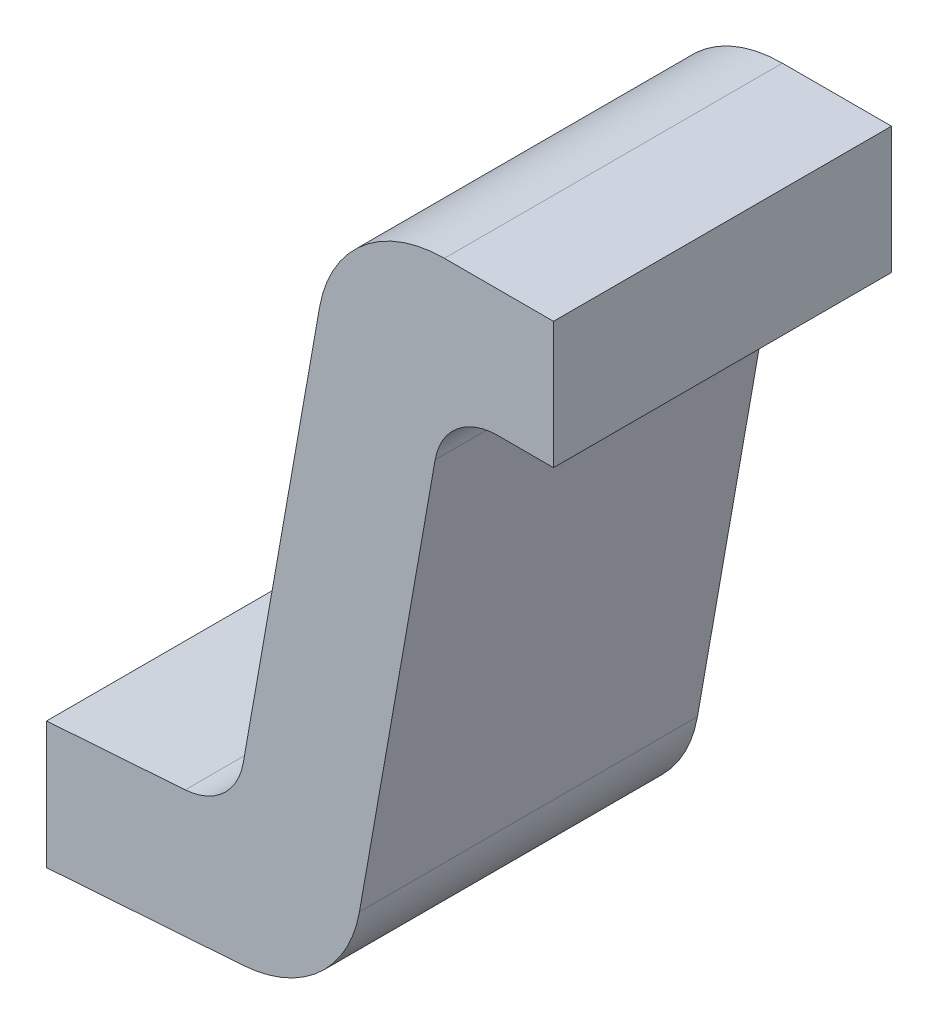
ISO-10303-21;
HEADER;
FILE_DESCRIPTION(('STEP AP214'),'2;1');
FILE_NAME('part.step','',(''),(''),'','','');
FILE_SCHEMA(('AUTOMOTIVE_DESIGN { 1 0 10303 214 1 1 1 1 }'));
ENDSEC;
DATA;
#1=APPLICATION_CONTEXT('core data for automotive mechanical design processes');
#2=APPLICATION_PROTOCOL_DEFINITION('international standard','automotive_design',2000,#1);
#3=PRODUCT_CONTEXT('',#1,'mechanical');
#4=PRODUCT('Part','Part','',(#3));
#5=PRODUCT_RELATED_PRODUCT_CATEGORY('part','',(#4));
#6=PRODUCT_DEFINITION_FORMATION('','',#4);
#7=PRODUCT_DEFINITION_CONTEXT('part definition',#1,'design');
#8=PRODUCT_DEFINITION('design','',#6,#7);
#9=PRODUCT_DEFINITION_SHAPE('','',#8);
#10=(LENGTH_UNIT() NAMED_UNIT(*) SI_UNIT(.MILLI.,.METRE.));
#11=(NAMED_UNIT(*) PLANE_ANGLE_UNIT() SI_UNIT($,.RADIAN.));
#12=(NAMED_UNIT(*) SI_UNIT($,.STERADIAN.) SOLID_ANGLE_UNIT());
#13=UNCERTAINTY_MEASURE_WITH_UNIT(LENGTH_MEASURE(1.E-05),#10,'distance_accuracy_value','');
#14=(GEOMETRIC_REPRESENTATION_CONTEXT(3) GLOBAL_UNCERTAINTY_ASSIGNED_CONTEXT((#13)) GLOBAL_UNIT_ASSIGNED_CONTEXT((#10,
#11,#12)) REPRESENTATION_CONTEXT('',''));
#15=CARTESIAN_POINT('',(0.,0.,0.));
#16=DIRECTION('',(0.,0.,1.));
#17=DIRECTION('',(1.,0.,0.));
#18=AXIS2_PLACEMENT_3D('',#15,#16,#17);
#19=CARTESIAN_POINT('',(0.320224528212,0.412415878806,-0.4));
#20=DIRECTION('',(0.,0.,1.));
#21=DIRECTION('',(1.,0.,0.));
#22=AXIS2_PLACEMENT_3D('',#19,#20,#21);
#23=PLANE('',#22);
#24=CARTESIAN_POINT('',(0.22262916084,0.165934032175,-0.4));
#25=DIRECTION('',(0.,0.,-1.));
#26=DIRECTION('',(0.669130606359133,-0.743144825477147,0.));
#27=AXIS2_PLACEMENT_3D('',#24,#25,#26);
#28=CIRCLE('',#27,0.15);
#29=CARTESIAN_POINT('',(0.370350323792,0.139886805525,-0.4));
#30=VERTEX_POINT('',#29);
#31=CARTESIAN_POINT('',(0.233092631902,0.01629942463642,-0.4));
#32=VERTEX_POINT('',#31);
#33=EDGE_CURVE('E172',#30,#32,#28,.T.);
#34=ORIENTED_EDGE('',*,*,#33,.T.);
#35=DIRECTION('',(0.997564050259825,0.0697564737441177,0.));
#36=VECTOR('',#35,1.);
#37=CARTESIAN_POINT('',(0.,0.,-0.4));
#38=LINE('',#37,#36);
#39=CARTESIAN_POINT('',(0.,0.,-0.4));
#40=VERTEX_POINT('',#39);
#41=EDGE_CURVE('E207',#40,#32,#38,.T.);
#42=ORIENTED_EDGE('',*,*,#41,.F.);
#43=DIRECTION('',(0.,-1.,0.));
#44=VECTOR('',#43,1.);
#45=CARTESIAN_POINT('',(0.,0.150366284712,-0.4));
#46=LINE('',#45,#44);
#47=CARTESIAN_POINT('',(0.,0.150366284712,-0.4));
#48=VERTEX_POINT('',#47);
#49=EDGE_CURVE('E25',#48,#40,#46,.T.);
#50=ORIENTED_EDGE('',*,*,#49,.F.);
#51=DIRECTION('',(-0.997564050259825,-0.0697564737441177,0.));
#52=VECTOR('',#51,1.);
#53=CARTESIAN_POINT('',(0.22262916084,0.165934032175,-0.4));
#54=LINE('',#53,#52);
#55=CARTESIAN_POINT('',(0.164175476791,0.161846552403,-0.4));
#56=VERTEX_POINT('',#55);
#57=EDGE_CURVE('E174',#56,#48,#54,.T.);
#58=ORIENTED_EDGE('',*,*,#57,.F.);
#59=CARTESIAN_POINT('',(0.15894374126,0.236663856173,-0.4));
#60=DIRECTION('',(0.,0.,1.));
#61=DIRECTION('',(0.669130606359133,-0.743144825477147,0.));
#62=AXIS2_PLACEMENT_3D('',#59,#60,#61);
#63=CIRCLE('',#62,0.075);
#64=CARTESIAN_POINT('',(0.232804322736,0.223640242848,-0.4));
#65=VERTEX_POINT('',#64);
#66=EDGE_CURVE('E199',#56,#65,#63,.T.);
#67=ORIENTED_EDGE('',*,*,#66,.T.);
#68=DIRECTION('',(-0.173648177667033,-0.98480775301219,0.));
#69=VECTOR('',#68,1.);
#70=CARTESIAN_POINT('',(0.345011717359,0.86,-0.4));
#71=LINE('',#70,#69);
#72=CARTESIAN_POINT('',(0.323155499084,0.73604722665,-0.4));
#73=VERTEX_POINT('',#72);
#74=EDGE_CURVE('E11',#73,#65,#71,.T.);
#75=ORIENTED_EDGE('',*,*,#74,.F.);
#76=CARTESIAN_POINT('',(0.470876662036,0.71,-0.4));
#77=DIRECTION('',(0.,0.,-1.));
#78=DIRECTION('',(-0.642787609686799,0.76604444311876,0.));
#79=AXIS2_PLACEMENT_3D('',#76,#77,#78);
#80=CIRCLE('',#79,0.15);
#81=CARTESIAN_POINT('',(0.470876662036,0.86,-0.4));
#82=VERTEX_POINT('',#81);
#83=EDGE_CURVE('E187',#73,#82,#80,.T.);
#84=ORIENTED_EDGE('',*,*,#83,.T.);
#85=DIRECTION('',(-1.,0.,0.));
#86=VECTOR('',#85,1.);
#87=CARTESIAN_POINT('',(0.6,0.86,-0.4));
#88=LINE('',#87,#86);
#89=CARTESIAN_POINT('',(0.6,0.86,-0.4));
#90=VERTEX_POINT('',#89);
#91=EDGE_CURVE('E260',#90,#82,#88,.T.);
#92=ORIENTED_EDGE('',*,*,#91,.F.);
#93=DIRECTION('',(0.,1.,0.));
#94=VECTOR('',#93,1.);
#95=CARTESIAN_POINT('',(0.6,0.71,-0.4));
#96=LINE('',#95,#94);
#97=CARTESIAN_POINT('',(0.6,0.71,-0.4));
#98=VERTEX_POINT('',#97);
#99=EDGE_CURVE('E46',#98,#90,#96,.T.);
#100=ORIENTED_EDGE('',*,*,#99,.F.);
#101=DIRECTION('',(1.,0.,0.));
#102=VECTOR('',#101,1.);
#103=CARTESIAN_POINT('',(0.470876662036,0.71,-0.4));
#104=LINE('',#103,#102);
#105=CARTESIAN_POINT('',(0.533809134374,0.71,-0.4));
#106=VERTEX_POINT('',#105);
#107=EDGE_CURVE('E134',#106,#98,#104,.T.);
#108=ORIENTED_EDGE('',*,*,#107,.F.);
#109=CARTESIAN_POINT('',(0.533809134374,0.635,-0.4));
#110=DIRECTION('',(0.,0.,1.));
#111=DIRECTION('',(-0.642787609686799,0.76604444311876,0.));
#112=AXIS2_PLACEMENT_3D('',#109,#110,#111);
#113=CIRCLE('',#112,0.075);
#114=CARTESIAN_POINT('',(0.459948552898,0.648023613325,-0.4));
#115=VERTEX_POINT('',#114);
#116=EDGE_CURVE('E138',#106,#115,#113,.T.);
#117=ORIENTED_EDGE('',*,*,#116,.T.);
#118=DIRECTION('',(0.173648177667033,0.98480775301219,0.));
#119=VECTOR('',#118,1.);
#120=CARTESIAN_POINT('',(0.35,0.02447438418023,-0.4));
#121=LINE('',#120,#119);
#122=EDGE_CURVE('E225',#30,#115,#121,.T.);
#123=ORIENTED_EDGE('',*,*,#122,.F.);
#124=EDGE_LOOP('',(#34,#42,#50,#58,#67,#75,#84,#92,#100,#108,#117,#123));
#125=FACE_BOUND('',#124,.T.);
#126=ADVANCED_FACE('F17',(#125),#23,.F.);
#127=CARTESIAN_POINT('',(0.345011717359,0.86,0.));
#128=DIRECTION('',(0.98480775301219,-0.173648177667033,0.));
#129=DIRECTION('',(0.,0.,-1.));
#130=AXIS2_PLACEMENT_3D('',#127,#128,#129);
#131=PLANE('',#130);
#132=DIRECTION('',(0.,0.,1.));
#133=VECTOR('',#132,1.);
#134=CARTESIAN_POINT('',(0.232804322736,0.223640242848,0.));
#135=LINE('',#134,#133);
#136=CARTESIAN_POINT('',(0.232804322736,0.223640242848,0.));
#137=VERTEX_POINT('',#136);
#138=EDGE_CURVE('E183',#65,#137,#135,.T.);
#139=ORIENTED_EDGE('',*,*,#138,.T.);
#140=DIRECTION('',(-0.173648177667033,-0.98480775301219,0.));
#141=VECTOR('',#140,1.);
#142=CARTESIAN_POINT('',(0.345011717359,0.86,0.));
#143=LINE('',#142,#141);
#144=CARTESIAN_POINT('',(0.323155499084,0.73604722665,0.));
#145=VERTEX_POINT('',#144);
#146=EDGE_CURVE('E236',#145,#137,#143,.T.);
#147=ORIENTED_EDGE('',*,*,#146,.F.);
#148=DIRECTION('',(0.,0.,-1.));
#149=VECTOR('',#148,1.);
#150=CARTESIAN_POINT('',(0.323155499084,0.73604722665,0.));
#151=LINE('',#150,#149);
#152=EDGE_CURVE('E249',#145,#73,#151,.T.);
#153=ORIENTED_EDGE('',*,*,#152,.T.);
#154=ORIENTED_EDGE('',*,*,#74,.T.);
#155=EDGE_LOOP('',(#139,#147,#153,#154));
#156=FACE_BOUND('',#155,.T.);
#157=ADVANCED_FACE('F296',(#156),#131,.F.);
#158=CARTESIAN_POINT('',(0.,0.150366284712,0.));
#159=DIRECTION('',(1.,0.,0.));
#160=DIRECTION('',(0.,-1.,0.));
#161=AXIS2_PLACEMENT_3D('',#158,#159,#160);
#162=PLANE('',#161);
#163=DIRECTION('',(0.,-1.,0.));
#164=VECTOR('',#163,1.);
#165=CARTESIAN_POINT('',(0.,0.150366284712,0.));
#166=LINE('',#165,#164);
#167=CARTESIAN_POINT('',(0.,0.150366284712,0.));
#168=VERTEX_POINT('',#167);
#169=CARTESIAN_POINT('',(0.,0.,0.));
#170=VERTEX_POINT('',#169);
#171=EDGE_CURVE('E188',#168,#170,#166,.T.);
#172=ORIENTED_EDGE('',*,*,#171,.F.);
#173=DIRECTION('',(0.,0.,-1.));
#174=VECTOR('',#173,1.);
#175=CARTESIAN_POINT('',(0.,0.150366284712,0.));
#176=LINE('',#175,#174);
#177=EDGE_CURVE('E173',#168,#48,#176,.T.);
#178=ORIENTED_EDGE('',*,*,#177,.T.);
#179=ORIENTED_EDGE('',*,*,#49,.T.);
#180=DIRECTION('',(0.,0.,-1.));
#181=VECTOR('',#180,1.);
#182=CARTESIAN_POINT('',(0.,0.,0.));
#183=LINE('',#182,#181);
#184=EDGE_CURVE('E265',#170,#40,#183,.T.);
#185=ORIENTED_EDGE('',*,*,#184,.F.);
#186=EDGE_LOOP('',(#172,#178,#179,#185));
#187=FACE_BOUND('',#186,.T.);
#188=ADVANCED_FACE('F285',(#187),#162,.F.);
#189=CARTESIAN_POINT('',(0.,0.,0.));
#190=DIRECTION('',(-0.0697564737441177,0.997564050259825,0.));
#191=DIRECTION('',(0.,0.,1.));
#192=AXIS2_PLACEMENT_3D('',#189,#190,#191);
#193=PLANE('',#192);
#194=DIRECTION('',(0.,0.,1.));
#195=VECTOR('',#194,1.);
#196=CARTESIAN_POINT('',(0.233092631902,0.01629942463642,0.));
#197=LINE('',#196,#195);
#198=CARTESIAN_POINT('',(0.233092631902,0.01629942463642,0.));
#199=VERTEX_POINT('',#198);
#200=EDGE_CURVE('E218',#32,#199,#197,.T.);
#201=ORIENTED_EDGE('',*,*,#200,.T.);
#202=DIRECTION('',(0.997564050259825,0.0697564737441177,0.));
#203=VECTOR('',#202,1.);
#204=CARTESIAN_POINT('',(0.,0.,0.));
#205=LINE('',#204,#203);
#206=EDGE_CURVE('E184',#170,#199,#205,.T.);
#207=ORIENTED_EDGE('',*,*,#206,.F.);
#208=ORIENTED_EDGE('',*,*,#184,.T.);
#209=ORIENTED_EDGE('',*,*,#41,.T.);
#210=EDGE_LOOP('',(#201,#207,#208,#209));
#211=FACE_BOUND('',#210,.T.);
#212=ADVANCED_FACE('F273',(#211),#193,.F.);
#213=CARTESIAN_POINT('',(0.6,0.71,0.));
#214=DIRECTION('',(-1.,0.,0.));
#215=DIRECTION('',(0.,1.,0.));
#216=AXIS2_PLACEMENT_3D('',#213,#214,#215);
#217=PLANE('',#216);
#218=DIRECTION('',(0.,1.,0.));
#219=VECTOR('',#218,1.);
#220=CARTESIAN_POINT('',(0.6,0.71,0.));
#221=LINE('',#220,#219);
#222=CARTESIAN_POINT('',(0.6,0.71,0.));
#223=VERTEX_POINT('',#222);
#224=CARTESIAN_POINT('',(0.6,0.86,0.));
#225=VERTEX_POINT('',#224);
#226=EDGE_CURVE('E228',#223,#225,#221,.T.);
#227=ORIENTED_EDGE('',*,*,#226,.F.);
#228=DIRECTION('',(0.,0.,-1.));
#229=VECTOR('',#228,1.);
#230=CARTESIAN_POINT('',(0.6,0.71,0.));
#231=LINE('',#230,#229);
#232=EDGE_CURVE('E143',#223,#98,#231,.T.);
#233=ORIENTED_EDGE('',*,*,#232,.T.);
#234=ORIENTED_EDGE('',*,*,#99,.T.);
#235=DIRECTION('',(0.,0.,-1.));
#236=VECTOR('',#235,1.);
#237=CARTESIAN_POINT('',(0.6,0.86,0.));
#238=LINE('',#237,#236);
#239=EDGE_CURVE('E256',#225,#90,#238,.T.);
#240=ORIENTED_EDGE('',*,*,#239,.F.);
#241=EDGE_LOOP('',(#227,#233,#234,#240));
#242=FACE_BOUND('',#241,.T.);
#243=ADVANCED_FACE('F305',(#242),#217,.F.);
#244=CARTESIAN_POINT('',(0.6,0.86,0.));
#245=DIRECTION('',(0.,-1.,0.));
#246=DIRECTION('',(0.,0.,-1.));
#247=AXIS2_PLACEMENT_3D('',#244,#245,#246);
#248=PLANE('',#247);
#249=DIRECTION('',(0.,0.,1.));
#250=VECTOR('',#249,1.);
#251=CARTESIAN_POINT('',(0.470876662036,0.86,0.));
#252=LINE('',#251,#250);
#253=CARTESIAN_POINT('',(0.470876662036,0.86,0.));
#254=VERTEX_POINT('',#253);
#255=EDGE_CURVE('E253',#82,#254,#252,.T.);
#256=ORIENTED_EDGE('',*,*,#255,.T.);
#257=DIRECTION('',(-1.,0.,0.));
#258=VECTOR('',#257,1.);
#259=CARTESIAN_POINT('',(0.6,0.86,0.));
#260=LINE('',#259,#258);
#261=EDGE_CURVE('E232',#225,#254,#260,.T.);
#262=ORIENTED_EDGE('',*,*,#261,.F.);
#263=ORIENTED_EDGE('',*,*,#239,.T.);
#264=ORIENTED_EDGE('',*,*,#91,.T.);
#265=EDGE_LOOP('',(#256,#262,#263,#264));
#266=FACE_BOUND('',#265,.T.);
#267=ADVANCED_FACE('F304',(#266),#248,.F.);
#268=CARTESIAN_POINT('',(0.470876662036,0.71,0.));
#269=DIRECTION('',(0.,0.,1.));
#270=DIRECTION('',(-0.642787609686799,0.76604444311876,0.));
#271=AXIS2_PLACEMENT_3D('',#268,#269,#270);
#272=CYLINDRICAL_SURFACE('',#271,0.15);
#273=ORIENTED_EDGE('',*,*,#83,.F.);
#274=ORIENTED_EDGE('',*,*,#152,.F.);
#275=CARTESIAN_POINT('',(0.470876662036,0.71,0.));
#276=DIRECTION('',(0.,0.,1.));
#277=DIRECTION('',(-0.642787609686799,0.76604444311876,0.));
#278=AXIS2_PLACEMENT_3D('',#275,#276,#277);
#279=CIRCLE('',#278,0.15);
#280=EDGE_CURVE('E240',#254,#145,#279,.T.);
#281=ORIENTED_EDGE('',*,*,#280,.F.);
#282=ORIENTED_EDGE('',*,*,#255,.F.);
#283=EDGE_LOOP('',(#273,#274,#281,#282));
#284=FACE_BOUND('',#283,.T.);
#285=ADVANCED_FACE('F301',(#284),#272,.T.);
#286=CARTESIAN_POINT('',(0.320224528212,0.412415878806,0.));
#287=DIRECTION('',(0.,0.,1.));
#288=DIRECTION('',(1.,0.,0.));
#289=AXIS2_PLACEMENT_3D('',#286,#287,#288);
#290=PLANE('',#289);
#291=CARTESIAN_POINT('',(0.22262916084,0.165934032175,0.));
#292=DIRECTION('',(0.,0.,1.));
#293=DIRECTION('',(0.669130606359133,-0.743144825477147,0.));
#294=AXIS2_PLACEMENT_3D('',#291,#292,#293);
#295=CIRCLE('',#294,0.15);
#296=CARTESIAN_POINT('',(0.370350323792,0.139886805525,0.));
#297=VERTEX_POINT('',#296);
#298=EDGE_CURVE('E214',#199,#297,#295,.T.);
#299=ORIENTED_EDGE('',*,*,#298,.T.);
#300=DIRECTION('',(0.173648177667033,0.98480775301219,0.));
#301=VECTOR('',#300,1.);
#302=CARTESIAN_POINT('',(0.35,0.02447438418023,0.));
#303=LINE('',#302,#301);
#304=CARTESIAN_POINT('',(0.459948552898,0.648023613325,0.));
#305=VERTEX_POINT('',#304);
#306=EDGE_CURVE('E222',#297,#305,#303,.T.);
#307=ORIENTED_EDGE('',*,*,#306,.T.);
#308=CARTESIAN_POINT('',(0.533809134374,0.635,0.));
#309=DIRECTION('',(0.,0.,-1.));
#310=DIRECTION('',(-0.642787609686799,0.76604444311876,0.));
#311=AXIS2_PLACEMENT_3D('',#308,#309,#310);
#312=CIRCLE('',#311,0.075);
#313=CARTESIAN_POINT('',(0.533809134374,0.71,0.));
#314=VERTEX_POINT('',#313);
#315=EDGE_CURVE('E164',#305,#314,#312,.T.);
#316=ORIENTED_EDGE('',*,*,#315,.T.);
#317=DIRECTION('',(1.,0.,0.));
#318=VECTOR('',#317,1.);
#319=CARTESIAN_POINT('',(0.470876662036,0.71,0.));
#320=LINE('',#319,#318);
#321=EDGE_CURVE('E149',#314,#223,#320,.T.);
#322=ORIENTED_EDGE('',*,*,#321,.T.);
#323=ORIENTED_EDGE('',*,*,#226,.T.);
#324=ORIENTED_EDGE('',*,*,#261,.T.);
#325=ORIENTED_EDGE('',*,*,#280,.T.);
#326=ORIENTED_EDGE('',*,*,#146,.T.);
#327=CARTESIAN_POINT('',(0.15894374126,0.236663856173,0.));
#328=DIRECTION('',(0.,0.,-1.));
#329=DIRECTION('',(0.669130606359133,-0.743144825477147,0.));
#330=AXIS2_PLACEMENT_3D('',#327,#328,#329);
#331=CIRCLE('',#330,0.075);
#332=CARTESIAN_POINT('',(0.164175476791,0.161846552403,0.));
#333=VERTEX_POINT('',#332);
#334=EDGE_CURVE('E179',#137,#333,#331,.T.);
#335=ORIENTED_EDGE('',*,*,#334,.T.);
#336=DIRECTION('',(-0.997564050259825,-0.0697564737441177,0.));
#337=VECTOR('',#336,1.);
#338=CARTESIAN_POINT('',(0.22262916084,0.165934032175,0.));
#339=LINE('',#338,#337);
#340=EDGE_CURVE('E168',#333,#168,#339,.T.);
#341=ORIENTED_EDGE('',*,*,#340,.T.);
#342=ORIENTED_EDGE('',*,*,#171,.T.);
#343=ORIENTED_EDGE('',*,*,#206,.T.);
#344=EDGE_LOOP('',(#299,#307,#316,#322,#323,#324,#325,#326,#335,#341,#342,#343));
#345=FACE_BOUND('',#344,.T.);
#346=ADVANCED_FACE('F283',(#345),#290,.T.);
#347=CARTESIAN_POINT('',(0.35,0.02447438418023,0.));
#348=DIRECTION('',(-0.98480775301219,0.173648177667033,0.));
#349=DIRECTION('',(0.,0.,1.));
#350=AXIS2_PLACEMENT_3D('',#347,#348,#349);
#351=PLANE('',#350);
#352=DIRECTION('',(0.,0.,1.));
#353=VECTOR('',#352,1.);
#354=CARTESIAN_POINT('',(0.459948552898,0.648023613325,0.));
#355=LINE('',#354,#353);
#356=EDGE_CURVE('E157',#115,#305,#355,.T.);
#357=ORIENTED_EDGE('',*,*,#356,.T.);
#358=ORIENTED_EDGE('',*,*,#306,.F.);
#359=DIRECTION('',(0.,0.,-1.));
#360=VECTOR('',#359,1.);
#361=CARTESIAN_POINT('',(0.370350323792,0.139886805525,0.));
#362=LINE('',#361,#360);
#363=EDGE_CURVE('E193',#297,#30,#362,.T.);
#364=ORIENTED_EDGE('',*,*,#363,.T.);
#365=ORIENTED_EDGE('',*,*,#122,.T.);
#366=EDGE_LOOP('',(#357,#358,#364,#365));
#367=FACE_BOUND('',#366,.T.);
#368=ADVANCED_FACE('F281',(#367),#351,.F.);
#369=CARTESIAN_POINT('',(0.22262916084,0.165934032175,0.));
#370=DIRECTION('',(0.,0.,1.));
#371=DIRECTION('',(0.669130606359133,-0.743144825477147,0.));
#372=AXIS2_PLACEMENT_3D('',#369,#370,#371);
#373=CYLINDRICAL_SURFACE('',#372,0.15);
#374=ORIENTED_EDGE('',*,*,#33,.F.);
#375=ORIENTED_EDGE('',*,*,#363,.F.);
#376=ORIENTED_EDGE('',*,*,#298,.F.);
#377=ORIENTED_EDGE('',*,*,#200,.F.);
#378=EDGE_LOOP('',(#374,#375,#376,#377));
#379=FACE_BOUND('',#378,.T.);
#380=ADVANCED_FACE('F278',(#379),#373,.T.);
#381=CARTESIAN_POINT('',(0.22262916084,0.165934032175,0.));
#382=DIRECTION('',(0.0697564737441177,-0.997564050259825,0.));
#383=DIRECTION('',(0.,0.,-1.));
#384=AXIS2_PLACEMENT_3D('',#381,#382,#383);
#385=PLANE('',#384);
#386=DIRECTION('',(0.,0.,-1.));
#387=VECTOR('',#386,1.);
#388=CARTESIAN_POINT('',(0.164175476791,0.161846552403,0.));
#389=LINE('',#388,#387);
#390=EDGE_CURVE('E177',#333,#56,#389,.T.);
#391=ORIENTED_EDGE('',*,*,#390,.T.);
#392=ORIENTED_EDGE('',*,*,#57,.T.);
#393=ORIENTED_EDGE('',*,*,#177,.F.);
#394=ORIENTED_EDGE('',*,*,#340,.F.);
#395=EDGE_LOOP('',(#391,#392,#393,#394));
#396=FACE_BOUND('',#395,.T.);
#397=ADVANCED_FACE('F287',(#396),#385,.F.);
#398=CARTESIAN_POINT('',(0.15894374126,0.236663856173,0.));
#399=DIRECTION('',(0.,0.,1.));
#400=DIRECTION('',(0.669130606359133,-0.743144825477147,0.));
#401=AXIS2_PLACEMENT_3D('',#398,#399,#400);
#402=CYLINDRICAL_SURFACE('',#401,0.075);
#403=ORIENTED_EDGE('',*,*,#334,.F.);
#404=ORIENTED_EDGE('',*,*,#138,.F.);
#405=ORIENTED_EDGE('',*,*,#66,.F.);
#406=ORIENTED_EDGE('',*,*,#390,.F.);
#407=EDGE_LOOP('',(#403,#404,#405,#406));
#408=FACE_BOUND('',#407,.T.);
#409=ADVANCED_FACE('F293',(#408),#402,.F.);
#410=CARTESIAN_POINT('',(0.470876662036,0.71,0.));
#411=DIRECTION('',(0.,1.,0.));
#412=DIRECTION('',(1.,0.,0.));
#413=AXIS2_PLACEMENT_3D('',#410,#411,#412);
#414=PLANE('',#413);
#415=DIRECTION('',(0.,0.,-1.));
#416=VECTOR('',#415,1.);
#417=CARTESIAN_POINT('',(0.533809134374,0.71,0.));
#418=LINE('',#417,#416);
#419=EDGE_CURVE('E144',#314,#106,#418,.T.);
#420=ORIENTED_EDGE('',*,*,#419,.T.);
#421=ORIENTED_EDGE('',*,*,#107,.T.);
#422=ORIENTED_EDGE('',*,*,#232,.F.);
#423=ORIENTED_EDGE('',*,*,#321,.F.);
#424=EDGE_LOOP('',(#420,#421,#422,#423));
#425=FACE_BOUND('',#424,.T.);
#426=ADVANCED_FACE('F147',(#425),#414,.F.);
#427=CARTESIAN_POINT('',(0.533809134374,0.635,0.));
#428=DIRECTION('',(0.,0.,1.));
#429=DIRECTION('',(-0.642787609686799,0.76604444311876,0.));
#430=AXIS2_PLACEMENT_3D('',#427,#428,#429);
#431=CYLINDRICAL_SURFACE('',#430,0.075);
#432=ORIENTED_EDGE('',*,*,#315,.F.);
#433=ORIENTED_EDGE('',*,*,#356,.F.);
#434=ORIENTED_EDGE('',*,*,#116,.F.);
#435=ORIENTED_EDGE('',*,*,#419,.F.);
#436=EDGE_LOOP('',(#432,#433,#434,#435));
#437=FACE_BOUND('',#436,.T.);
#438=ADVANCED_FACE('F155',(#437),#431,.F.);
#439=CLOSED_SHELL('',(#126,#157,#188,#212,#243,#267,#285,#346,#368,#380,#397,#409,#426,#438));
#440=MANIFOLD_SOLID_BREP('B1',#439);
#441=ADVANCED_BREP_SHAPE_REPRESENTATION('',(#18,#440),#14);
#442=SHAPE_DEFINITION_REPRESENTATION(#9,#441);
ENDSEC;
END-ISO-10303-21;
